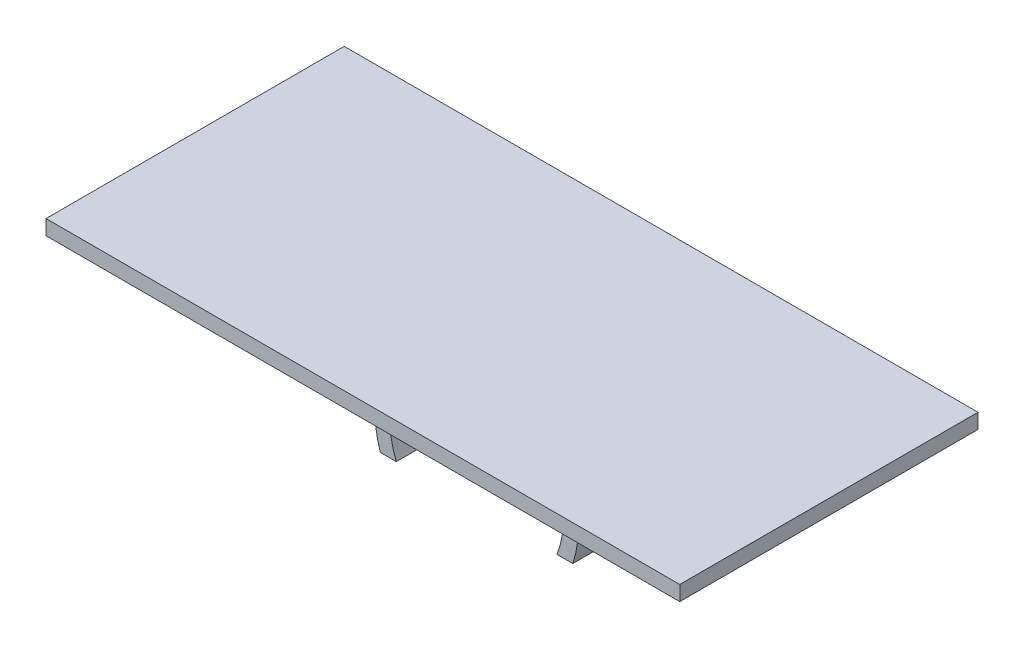
ISO-10303-21;
HEADER;
FILE_DESCRIPTION(('STEP AP214'),'2;1');
FILE_NAME('part.step','',(''),(''),'','','');
FILE_SCHEMA(('AUTOMOTIVE_DESIGN { 1 0 10303 214 1 1 1 1 }'));
ENDSEC;
DATA;
#1=APPLICATION_CONTEXT('core data for automotive mechanical design processes');
#2=APPLICATION_PROTOCOL_DEFINITION('international standard','automotive_design',2000,#1);
#3=PRODUCT_CONTEXT('',#1,'mechanical');
#4=PRODUCT('Part','Part','',(#3));
#5=PRODUCT_RELATED_PRODUCT_CATEGORY('part','',(#4));
#6=PRODUCT_DEFINITION_FORMATION('','',#4);
#7=PRODUCT_DEFINITION_CONTEXT('part definition',#1,'design');
#8=PRODUCT_DEFINITION('design','',#6,#7);
#9=PRODUCT_DEFINITION_SHAPE('','',#8);
#10=(LENGTH_UNIT() NAMED_UNIT(*) SI_UNIT(.MILLI.,.METRE.));
#11=(NAMED_UNIT(*) PLANE_ANGLE_UNIT() SI_UNIT($,.RADIAN.));
#12=(NAMED_UNIT(*) SI_UNIT($,.STERADIAN.) SOLID_ANGLE_UNIT());
#13=UNCERTAINTY_MEASURE_WITH_UNIT(LENGTH_MEASURE(1.E-05),#10,'distance_accuracy_value','');
#14=(GEOMETRIC_REPRESENTATION_CONTEXT(3) GLOBAL_UNCERTAINTY_ASSIGNED_CONTEXT((#13)) GLOBAL_UNIT_ASSIGNED_CONTEXT((#10,
#11,#12)) REPRESENTATION_CONTEXT('',''));
#15=CARTESIAN_POINT('',(0.,0.,0.));
#16=DIRECTION('',(0.,0.,1.));
#17=DIRECTION('',(1.,0.,0.));
#18=AXIS2_PLACEMENT_3D('',#15,#16,#17);
#19=CARTESIAN_POINT('',(-16.5075740192192,8.625,50.));
#20=DIRECTION('',(0.,0.,-1.));
#21=DIRECTION('',(-1.,0.,0.));
#22=AXIS2_PLACEMENT_3D('',#19,#20,#21);
#23=CYLINDRICAL_SURFACE('',#22,5.);
#24=CARTESIAN_POINT('',(-16.5075740192192,8.625,34.75));
#25=DIRECTION('',(0.,0.,1.));
#26=DIRECTION('',(1.,0.,0.));
#27=AXIS2_PLACEMENT_3D('',#24,#25,#26);
#28=CIRCLE('',#27,5.);
#29=CARTESIAN_POINT('',(-16.5075740192192,13.625,34.75));
#30=VERTEX_POINT('',#29);
#31=CARTESIAN_POINT('',(-12.0760105241268,6.30956375838926,34.75));
#32=VERTEX_POINT('',#31);
#33=EDGE_CURVE('E200',#30,#32,#28,.F.);
#34=ORIENTED_EDGE('',*,*,#33,.F.);
#35=DIRECTION('',(0.,0.,-1.));
#36=VECTOR('',#35,1.);
#37=CARTESIAN_POINT('',(-16.5075740192192,13.625,50.));
#38=LINE('',#37,#36);
#39=CARTESIAN_POINT('',(-16.5075740192192,13.625,25.25));
#40=VERTEX_POINT('',#39);
#41=EDGE_CURVE('E62',#30,#40,#38,.T.);
#42=ORIENTED_EDGE('',*,*,#41,.T.);
#43=CARTESIAN_POINT('',(-16.5075740192192,8.625,25.25));
#44=DIRECTION('',(0.,0.,-1.));
#45=DIRECTION('',(-1.,0.,0.));
#46=AXIS2_PLACEMENT_3D('',#43,#44,#45);
#47=CIRCLE('',#46,5.);
#48=CARTESIAN_POINT('',(-12.0760105241268,6.30956375838926,25.25));
#49=VERTEX_POINT('',#48);
#50=EDGE_CURVE('E157',#49,#40,#47,.F.);
#51=ORIENTED_EDGE('',*,*,#50,.F.);
#52=DIRECTION('',(0.,0.,-1.));
#53=VECTOR('',#52,1.);
#54=CARTESIAN_POINT('',(-12.0760105241268,6.30956375838926,50.));
#55=LINE('',#54,#53);
#56=EDGE_CURVE('E195',#32,#49,#55,.T.);
#57=ORIENTED_EDGE('',*,*,#56,.F.);
#58=EDGE_LOOP('',(#34,#42,#51,#57));
#59=FACE_BOUND('',#58,.T.);
#60=ADVANCED_FACE('F53',(#59),#23,.F.);
#61=CARTESIAN_POINT('',(0.,0.,50.));
#62=DIRECTION('',(0.,0.,-1.));
#63=DIRECTION('',(-1.,0.,0.));
#64=AXIS2_PLACEMENT_3D('',#61,#62,#63);
#65=CYLINDRICAL_SURFACE('',#64,13.625);
#66=CARTESIAN_POINT('',(0.,0.,34.75));
#67=DIRECTION('',(0.,0.,1.));
#68=DIRECTION('',(1.,0.,0.));
#69=AXIS2_PLACEMENT_3D('',#66,#67,#68);
#70=CIRCLE('',#69,13.625);
#71=CARTESIAN_POINT('',(-12.9034879005639,-4.375,34.75));
#72=VERTEX_POINT('',#71);
#73=EDGE_CURVE('E204',#32,#72,#70,.T.);
#74=ORIENTED_EDGE('',*,*,#73,.F.);
#75=ORIENTED_EDGE('',*,*,#56,.T.);
#76=CARTESIAN_POINT('',(0.,0.,25.25));
#77=DIRECTION('',(0.,0.,-1.));
#78=DIRECTION('',(-1.,0.,0.));
#79=AXIS2_PLACEMENT_3D('',#76,#77,#78);
#80=CIRCLE('',#79,13.625);
#81=CARTESIAN_POINT('',(-12.9034879005639,-4.375,25.25));
#82=VERTEX_POINT('',#81);
#83=EDGE_CURVE('E382',#82,#49,#80,.T.);
#84=ORIENTED_EDGE('',*,*,#83,.F.);
#85=DIRECTION('',(0.,0.,-1.));
#86=VECTOR('',#85,1.);
#87=CARTESIAN_POINT('',(-12.9034879005639,-4.375,50.));
#88=LINE('',#87,#86);
#89=EDGE_CURVE('E192',#72,#82,#88,.T.);
#90=ORIENTED_EDGE('',*,*,#89,.F.);
#91=EDGE_LOOP('',(#74,#75,#84,#90));
#92=FACE_BOUND('',#91,.T.);
#93=ADVANCED_FACE('F242',(#92),#65,.T.);
#94=CARTESIAN_POINT('',(-10.770329614269,-4.375,50.));
#95=DIRECTION('',(0.,1.,0.));
#96=DIRECTION('',(-1.,0.,0.));
#97=AXIS2_PLACEMENT_3D('',#94,#95,#96);
#98=PLANE('',#97);
#99=DIRECTION('',(1.,0.,0.));
#100=VECTOR('',#99,1.);
#101=CARTESIAN_POINT('',(-10.770329614269,-4.375,34.75));
#102=LINE('',#101,#100);
#103=CARTESIAN_POINT('',(-10.770329614269,-4.37500000000001,34.75));
#104=VERTEX_POINT('',#103);
#105=EDGE_CURVE('E209',#72,#104,#102,.T.);
#106=ORIENTED_EDGE('',*,*,#105,.F.);
#107=ORIENTED_EDGE('',*,*,#89,.T.);
#108=DIRECTION('',(-1.,0.,0.));
#109=VECTOR('',#108,1.);
#110=CARTESIAN_POINT('',(-10.770329614269,-4.375,25.25));
#111=LINE('',#110,#109);
#112=CARTESIAN_POINT('',(-10.770329614269,-4.37500000000001,25.25));
#113=VERTEX_POINT('',#112);
#114=EDGE_CURVE('E377',#113,#82,#111,.T.);
#115=ORIENTED_EDGE('',*,*,#114,.F.);
#116=DIRECTION('',(0.,0.,-1.));
#117=VECTOR('',#116,1.);
#118=CARTESIAN_POINT('',(-10.770329614269,-4.37500000000001,50.));
#119=LINE('',#118,#117);
#120=EDGE_CURVE('E189',#104,#113,#119,.T.);
#121=ORIENTED_EDGE('',*,*,#120,.F.);
#122=EDGE_LOOP('',(#106,#107,#115,#121));
#123=FACE_BOUND('',#122,.T.);
#124=ADVANCED_FACE('F246',(#123),#98,.F.);
#125=CARTESIAN_POINT('',(0.,0.,50.));
#126=DIRECTION('',(0.,0.,-1.));
#127=DIRECTION('',(-1.,0.,0.));
#128=AXIS2_PLACEMENT_3D('',#125,#126,#127);
#129=CYLINDRICAL_SURFACE('',#128,11.625);
#130=CARTESIAN_POINT('',(0.,0.,34.75));
#131=DIRECTION('',(0.,0.,1.));
#132=DIRECTION('',(1.,0.,0.));
#133=AXIS2_PLACEMENT_3D('',#130,#131,#132);
#134=CIRCLE('',#133,11.625);
#135=CARTESIAN_POINT('',(10.770329614269,-4.375,34.75));
#136=VERTEX_POINT('',#135);
#137=EDGE_CURVE('E387',#104,#136,#134,.F.);
#138=ORIENTED_EDGE('',*,*,#137,.F.);
#139=ORIENTED_EDGE('',*,*,#120,.T.);
#140=CARTESIAN_POINT('',(0.,0.,25.25));
#141=DIRECTION('',(0.,0.,-1.));
#142=DIRECTION('',(-1.,0.,0.));
#143=AXIS2_PLACEMENT_3D('',#140,#141,#142);
#144=CIRCLE('',#143,11.625);
#145=CARTESIAN_POINT('',(10.770329614269,-4.375,25.25));
#146=VERTEX_POINT('',#145);
#147=EDGE_CURVE('E375',#146,#113,#144,.F.);
#148=ORIENTED_EDGE('',*,*,#147,.F.);
#149=DIRECTION('',(0.,0.,-1.));
#150=VECTOR('',#149,1.);
#151=CARTESIAN_POINT('',(10.770329614269,-4.375,50.));
#152=LINE('',#151,#150);
#153=EDGE_CURVE('E186',#136,#146,#152,.T.);
#154=ORIENTED_EDGE('',*,*,#153,.F.);
#155=EDGE_LOOP('',(#138,#139,#148,#154));
#156=FACE_BOUND('',#155,.T.);
#157=ADVANCED_FACE('F252',(#156),#129,.F.);
#158=CARTESIAN_POINT('',(12.9034879005639,-4.375,50.));
#159=DIRECTION('',(0.,1.,0.));
#160=DIRECTION('',(-1.,0.,0.));
#161=AXIS2_PLACEMENT_3D('',#158,#159,#160);
#162=PLANE('',#161);
#163=DIRECTION('',(1.,0.,0.));
#164=VECTOR('',#163,1.);
#165=CARTESIAN_POINT('',(12.9034879005639,-4.375,34.75));
#166=LINE('',#165,#164);
#167=CARTESIAN_POINT('',(12.9034879005639,-4.375,34.75));
#168=VERTEX_POINT('',#167);
#169=EDGE_CURVE('E367',#136,#168,#166,.T.);
#170=ORIENTED_EDGE('',*,*,#169,.F.);
#171=ORIENTED_EDGE('',*,*,#153,.T.);
#172=DIRECTION('',(-1.,0.,0.));
#173=VECTOR('',#172,1.);
#174=CARTESIAN_POINT('',(12.9034879005639,-4.375,25.25));
#175=LINE('',#174,#173);
#176=CARTESIAN_POINT('',(12.9034879005639,-4.375,25.25));
#177=VERTEX_POINT('',#176);
#178=EDGE_CURVE('E373',#177,#146,#175,.T.);
#179=ORIENTED_EDGE('',*,*,#178,.F.);
#180=DIRECTION('',(0.,0.,-1.));
#181=VECTOR('',#180,1.);
#182=CARTESIAN_POINT('',(12.9034879005639,-4.375,50.));
#183=LINE('',#182,#181);
#184=EDGE_CURVE('E178',#168,#177,#183,.T.);
#185=ORIENTED_EDGE('',*,*,#184,.F.);
#186=EDGE_LOOP('',(#170,#171,#179,#185));
#187=FACE_BOUND('',#186,.T.);
#188=ADVANCED_FACE('F256',(#187),#162,.F.);
#189=CARTESIAN_POINT('',(0.,0.,50.));
#190=DIRECTION('',(0.,0.,-1.));
#191=DIRECTION('',(-1.,0.,0.));
#192=AXIS2_PLACEMENT_3D('',#189,#190,#191);
#193=CYLINDRICAL_SURFACE('',#192,13.625);
#194=CARTESIAN_POINT('',(0.,0.,34.75));
#195=DIRECTION('',(0.,0.,1.));
#196=DIRECTION('',(1.,0.,0.));
#197=AXIS2_PLACEMENT_3D('',#194,#195,#196);
#198=CIRCLE('',#197,13.625);
#199=CARTESIAN_POINT('',(12.0760105241268,6.30956375838927,34.75));
#200=VERTEX_POINT('',#199);
#201=EDGE_CURVE('E365',#168,#200,#198,.T.);
#202=ORIENTED_EDGE('',*,*,#201,.F.);
#203=ORIENTED_EDGE('',*,*,#184,.T.);
#204=CARTESIAN_POINT('',(0.,0.,25.25));
#205=DIRECTION('',(0.,0.,-1.));
#206=DIRECTION('',(-1.,0.,0.));
#207=AXIS2_PLACEMENT_3D('',#204,#205,#206);
#208=CIRCLE('',#207,13.625);
#209=CARTESIAN_POINT('',(12.0760105241268,6.30956375838927,25.25));
#210=VERTEX_POINT('',#209);
#211=EDGE_CURVE('E172',#210,#177,#208,.T.);
#212=ORIENTED_EDGE('',*,*,#211,.F.);
#213=DIRECTION('',(0.,0.,-1.));
#214=VECTOR('',#213,1.);
#215=CARTESIAN_POINT('',(12.0760105241268,6.30956375838927,50.));
#216=LINE('',#215,#214);
#217=EDGE_CURVE('E171',#200,#210,#216,.T.);
#218=ORIENTED_EDGE('',*,*,#217,.F.);
#219=EDGE_LOOP('',(#202,#203,#212,#218));
#220=FACE_BOUND('',#219,.T.);
#221=ADVANCED_FACE('F260',(#220),#193,.T.);
#222=CARTESIAN_POINT('',(16.5075740192192,8.625,50.));
#223=DIRECTION('',(0.,0.,-1.));
#224=DIRECTION('',(-1.,0.,0.));
#225=AXIS2_PLACEMENT_3D('',#222,#223,#224);
#226=CYLINDRICAL_SURFACE('',#225,5.);
#227=CARTESIAN_POINT('',(16.5075740192192,8.625,34.75));
#228=DIRECTION('',(0.,0.,1.));
#229=DIRECTION('',(1.,0.,0.));
#230=AXIS2_PLACEMENT_3D('',#227,#228,#229);
#231=CIRCLE('',#230,5.);
#232=CARTESIAN_POINT('',(16.5075740192192,13.625,34.75));
#233=VERTEX_POINT('',#232);
#234=EDGE_CURVE('E368',#200,#233,#231,.F.);
#235=ORIENTED_EDGE('',*,*,#234,.F.);
#236=ORIENTED_EDGE('',*,*,#217,.T.);
#237=CARTESIAN_POINT('',(16.5075740192192,8.625,25.25));
#238=DIRECTION('',(0.,0.,-1.));
#239=DIRECTION('',(-1.,0.,0.));
#240=AXIS2_PLACEMENT_3D('',#237,#238,#239);
#241=CIRCLE('',#240,5.);
#242=CARTESIAN_POINT('',(16.5075740192192,13.625,25.25));
#243=VERTEX_POINT('',#242);
#244=EDGE_CURVE('E154',#243,#210,#241,.F.);
#245=ORIENTED_EDGE('',*,*,#244,.F.);
#246=DIRECTION('',(0.,0.,-1.));
#247=VECTOR('',#246,1.);
#248=CARTESIAN_POINT('',(16.5075740192192,13.625,50.));
#249=LINE('',#248,#247);
#250=EDGE_CURVE('E169',#233,#243,#249,.T.);
#251=ORIENTED_EDGE('',*,*,#250,.F.);
#252=EDGE_LOOP('',(#235,#236,#245,#251));
#253=FACE_BOUND('',#252,.T.);
#254=ADVANCED_FACE('F168',(#253),#226,.F.);
#255=CARTESIAN_POINT('',(-16.5075740192192,8.625,10.));
#256=DIRECTION('',(0.,0.,1.));
#257=DIRECTION('',(1.,0.,0.));
#258=AXIS2_PLACEMENT_3D('',#255,#256,#257);
#259=PLANE('',#258);
#260=DIRECTION('',(1.,0.,0.));
#261=VECTOR('',#260,1.);
#262=CARTESIAN_POINT('',(16.5075740192192,13.625,10.));
#263=LINE('',#262,#261);
#264=CARTESIAN_POINT('',(-42.5,13.625,10.));
#265=VERTEX_POINT('',#264);
#266=CARTESIAN_POINT('',(42.5,13.625,10.));
#267=VERTEX_POINT('',#266);
#268=EDGE_CURVE('E207',#265,#267,#263,.T.);
#269=ORIENTED_EDGE('',*,*,#268,.F.);
#270=DIRECTION('',(0.,-1.,0.));
#271=VECTOR('',#270,1.);
#272=CARTESIAN_POINT('',(-42.5,15.625,10.));
#273=LINE('',#272,#271);
#274=CARTESIAN_POINT('',(-42.5,15.625,10.));
#275=VERTEX_POINT('',#274);
#276=EDGE_CURVE('E203',#275,#265,#273,.T.);
#277=ORIENTED_EDGE('',*,*,#276,.F.);
#278=DIRECTION('',(-1.,0.,0.));
#279=VECTOR('',#278,1.);
#280=CARTESIAN_POINT('',(-42.5,15.625,10.));
#281=LINE('',#280,#279);
#282=CARTESIAN_POINT('',(42.5,15.625,10.));
#283=VERTEX_POINT('',#282);
#284=EDGE_CURVE('E94',#283,#275,#281,.T.);
#285=ORIENTED_EDGE('',*,*,#284,.F.);
#286=DIRECTION('',(0.,1.,0.));
#287=VECTOR('',#286,1.);
#288=CARTESIAN_POINT('',(42.5,15.625,10.));
#289=LINE('',#288,#287);
#290=EDGE_CURVE('E88',#267,#283,#289,.T.);
#291=ORIENTED_EDGE('',*,*,#290,.F.);
#292=EDGE_LOOP('',(#269,#277,#285,#291));
#293=FACE_BOUND('',#292,.T.);
#294=ADVANCED_FACE('F227',(#293),#259,.F.);
#295=CARTESIAN_POINT('',(-42.5,15.625,50.));
#296=DIRECTION('',(1.,0.,0.));
#297=DIRECTION('',(0.,0.,-1.));
#298=AXIS2_PLACEMENT_3D('',#295,#296,#297);
#299=PLANE('',#298);
#300=ORIENTED_EDGE('',*,*,#276,.T.);
#301=DIRECTION('',(0.,0.,-1.));
#302=VECTOR('',#301,1.);
#303=CARTESIAN_POINT('',(-42.5,13.625,50.));
#304=LINE('',#303,#302);
#305=CARTESIAN_POINT('',(-42.5,13.625,50.));
#306=VERTEX_POINT('',#305);
#307=EDGE_CURVE('E12',#306,#265,#304,.T.);
#308=ORIENTED_EDGE('',*,*,#307,.F.);
#309=DIRECTION('',(0.,-1.,0.));
#310=VECTOR('',#309,1.);
#311=CARTESIAN_POINT('',(-42.5,15.625,50.));
#312=LINE('',#311,#310);
#313=CARTESIAN_POINT('',(-42.5,15.625,50.));
#314=VERTEX_POINT('',#313);
#315=EDGE_CURVE('E213',#314,#306,#312,.T.);
#316=ORIENTED_EDGE('',*,*,#315,.F.);
#317=DIRECTION('',(0.,0.,-1.));
#318=VECTOR('',#317,1.);
#319=CARTESIAN_POINT('',(-42.5,15.625,50.));
#320=LINE('',#319,#318);
#321=EDGE_CURVE('E218',#314,#275,#320,.T.);
#322=ORIENTED_EDGE('',*,*,#321,.T.);
#323=EDGE_LOOP('',(#300,#308,#316,#322));
#324=FACE_BOUND('',#323,.T.);
#325=ADVANCED_FACE('F55',(#324),#299,.F.);
#326=CARTESIAN_POINT('',(16.5075740192192,13.625,50.));
#327=DIRECTION('',(0.,1.,0.));
#328=DIRECTION('',(0.,0.,1.));
#329=AXIS2_PLACEMENT_3D('',#326,#327,#328);
#330=PLANE('',#329);
#331=ORIENTED_EDGE('',*,*,#268,.T.);
#332=DIRECTION('',(0.,0.,-1.));
#333=VECTOR('',#332,1.);
#334=CARTESIAN_POINT('',(42.5,13.625,50.));
#335=LINE('',#334,#333);
#336=CARTESIAN_POINT('',(42.5,13.625,50.));
#337=VERTEX_POINT('',#336);
#338=EDGE_CURVE('E176',#337,#267,#335,.T.);
#339=ORIENTED_EDGE('',*,*,#338,.F.);
#340=DIRECTION('',(1.,0.,0.));
#341=VECTOR('',#340,1.);
#342=CARTESIAN_POINT('',(-42.5,13.625,50.));
#343=LINE('',#342,#341);
#344=EDGE_CURVE('E101',#306,#337,#343,.T.);
#345=ORIENTED_EDGE('',*,*,#344,.F.);
#346=ORIENTED_EDGE('',*,*,#307,.T.);
#347=EDGE_LOOP('',(#331,#339,#345,#346));
#348=FACE_BOUND('',#347,.T.);
#349=ORIENTED_EDGE('',*,*,#41,.F.);
#350=DIRECTION('',(1.,0.,0.));
#351=VECTOR('',#350,1.);
#352=CARTESIAN_POINT('',(-27.0163696586461,13.625,34.75));
#353=LINE('',#352,#351);
#354=EDGE_CURVE('E162',#30,#233,#353,.T.);
#355=ORIENTED_EDGE('',*,*,#354,.T.);
#356=ORIENTED_EDGE('',*,*,#250,.T.);
#357=DIRECTION('',(-1.,0.,0.));
#358=VECTOR('',#357,1.);
#359=CARTESIAN_POINT('',(27.2773973848166,13.625,25.25));
#360=LINE('',#359,#358);
#361=EDGE_CURVE('E151',#243,#40,#360,.T.);
#362=ORIENTED_EDGE('',*,*,#361,.T.);
#363=EDGE_LOOP('',(#349,#355,#356,#362));
#364=FACE_BOUND('',#363,.T.);
#365=ADVANCED_FACE('F175',(#348,#364),#330,.F.);
#366=CARTESIAN_POINT('',(42.5,15.625,50.));
#367=DIRECTION('',(-1.,0.,0.));
#368=DIRECTION('',(0.,0.,1.));
#369=AXIS2_PLACEMENT_3D('',#366,#367,#368);
#370=PLANE('',#369);
#371=ORIENTED_EDGE('',*,*,#290,.T.);
#372=DIRECTION('',(0.,0.,-1.));
#373=VECTOR('',#372,1.);
#374=CARTESIAN_POINT('',(42.5,15.625,50.));
#375=LINE('',#374,#373);
#376=CARTESIAN_POINT('',(42.5,15.625,50.));
#377=VERTEX_POINT('',#376);
#378=EDGE_CURVE('E180',#377,#283,#375,.T.);
#379=ORIENTED_EDGE('',*,*,#378,.F.);
#380=DIRECTION('',(0.,1.,0.));
#381=VECTOR('',#380,1.);
#382=CARTESIAN_POINT('',(42.5,15.625,50.));
#383=LINE('',#382,#381);
#384=EDGE_CURVE('E216',#337,#377,#383,.T.);
#385=ORIENTED_EDGE('',*,*,#384,.F.);
#386=ORIENTED_EDGE('',*,*,#338,.T.);
#387=EDGE_LOOP('',(#371,#379,#385,#386));
#388=FACE_BOUND('',#387,.T.);
#389=ADVANCED_FACE('F232',(#388),#370,.F.);
#390=CARTESIAN_POINT('',(-42.5,15.625,50.));
#391=DIRECTION('',(0.,-1.,0.));
#392=DIRECTION('',(1.,0.,0.));
#393=AXIS2_PLACEMENT_3D('',#390,#391,#392);
#394=PLANE('',#393);
#395=ORIENTED_EDGE('',*,*,#284,.T.);
#396=ORIENTED_EDGE('',*,*,#321,.F.);
#397=DIRECTION('',(-1.,0.,0.));
#398=VECTOR('',#397,1.);
#399=CARTESIAN_POINT('',(-42.5,15.625,50.));
#400=LINE('',#399,#398);
#401=EDGE_CURVE('E70',#377,#314,#400,.T.);
#402=ORIENTED_EDGE('',*,*,#401,.F.);
#403=ORIENTED_EDGE('',*,*,#378,.T.);
#404=EDGE_LOOP('',(#395,#396,#402,#403));
#405=FACE_BOUND('',#404,.T.);
#406=ADVANCED_FACE('F223',(#405),#394,.F.);
#407=CARTESIAN_POINT('',(-16.5075740192192,8.625,50.));
#408=DIRECTION('',(0.,0.,1.));
#409=DIRECTION('',(1.,0.,0.));
#410=AXIS2_PLACEMENT_3D('',#407,#408,#409);
#411=PLANE('',#410);
#412=ORIENTED_EDGE('',*,*,#344,.T.);
#413=ORIENTED_EDGE('',*,*,#384,.T.);
#414=ORIENTED_EDGE('',*,*,#401,.T.);
#415=ORIENTED_EDGE('',*,*,#315,.T.);
#416=EDGE_LOOP('',(#412,#413,#414,#415));
#417=FACE_BOUND('',#416,.T.);
#418=ADVANCED_FACE('F231',(#417),#411,.T.);
#419=CARTESIAN_POINT('',(27.2773973848166,-28.375,25.25));
#420=DIRECTION('',(0.,0.,-1.));
#421=DIRECTION('',(-1.,0.,0.));
#422=AXIS2_PLACEMENT_3D('',#419,#420,#421);
#423=PLANE('',#422);
#424=ORIENTED_EDGE('',*,*,#50,.T.);
#425=ORIENTED_EDGE('',*,*,#361,.F.);
#426=ORIENTED_EDGE('',*,*,#244,.T.);
#427=ORIENTED_EDGE('',*,*,#211,.T.);
#428=ORIENTED_EDGE('',*,*,#178,.T.);
#429=ORIENTED_EDGE('',*,*,#147,.T.);
#430=ORIENTED_EDGE('',*,*,#114,.T.);
#431=ORIENTED_EDGE('',*,*,#83,.T.);
#432=EDGE_LOOP('',(#424,#425,#426,#427,#428,#429,#430,#431));
#433=FACE_BOUND('',#432,.T.);
#434=ADVANCED_FACE('F153',(#433),#423,.T.);
#435=CARTESIAN_POINT('',(-27.0163696586461,-28.375,34.75));
#436=DIRECTION('',(0.,0.,1.));
#437=DIRECTION('',(1.,0.,0.));
#438=AXIS2_PLACEMENT_3D('',#435,#436,#437);
#439=PLANE('',#438);
#440=ORIENTED_EDGE('',*,*,#33,.T.);
#441=ORIENTED_EDGE('',*,*,#73,.T.);
#442=ORIENTED_EDGE('',*,*,#105,.T.);
#443=ORIENTED_EDGE('',*,*,#137,.T.);
#444=ORIENTED_EDGE('',*,*,#169,.T.);
#445=ORIENTED_EDGE('',*,*,#201,.T.);
#446=ORIENTED_EDGE('',*,*,#234,.T.);
#447=ORIENTED_EDGE('',*,*,#354,.F.);
#448=EDGE_LOOP('',(#440,#441,#442,#443,#444,#445,#446,#447));
#449=FACE_BOUND('',#448,.T.);
#450=ADVANCED_FACE('F278',(#449),#439,.T.);
#451=CLOSED_SHELL('',(#60,#93,#124,#157,#188,#221,#254,#294,#325,#365,#389,#406,#418,#434,#450));
#452=MANIFOLD_SOLID_BREP('B2',#451);
#453=ADVANCED_BREP_SHAPE_REPRESENTATION('',(#18,#452),#14);
#454=SHAPE_DEFINITION_REPRESENTATION(#9,#453);
ENDSEC;
END-ISO-10303-21;
